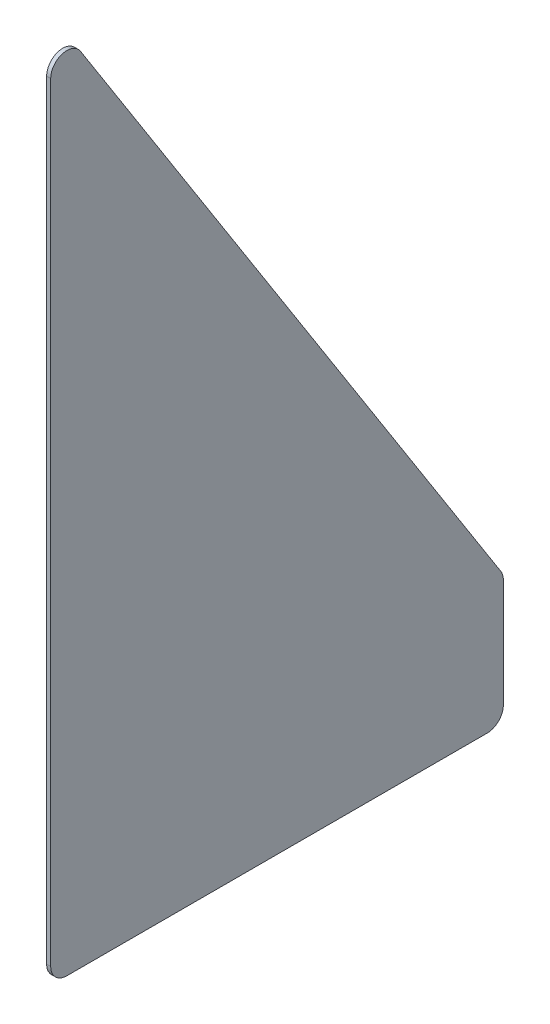
ISO-10303-21;
HEADER;
FILE_DESCRIPTION(('STEP AP214'),'2;1');
FILE_NAME('part.step','',(''),(''),'','','');
FILE_SCHEMA(('AUTOMOTIVE_DESIGN { 1 0 10303 214 1 1 1 1 }'));
ENDSEC;
DATA;
#1=APPLICATION_CONTEXT('core data for automotive mechanical design processes');
#2=APPLICATION_PROTOCOL_DEFINITION('international standard','automotive_design',2000,#1);
#3=PRODUCT_CONTEXT('',#1,'mechanical');
#4=PRODUCT('Part','Part','',(#3));
#5=PRODUCT_RELATED_PRODUCT_CATEGORY('part','',(#4));
#6=PRODUCT_DEFINITION_FORMATION('','',#4);
#7=PRODUCT_DEFINITION_CONTEXT('part definition',#1,'design');
#8=PRODUCT_DEFINITION('design','',#6,#7);
#9=PRODUCT_DEFINITION_SHAPE('','',#8);
#10=(LENGTH_UNIT() NAMED_UNIT(*) SI_UNIT(.MILLI.,.METRE.));
#11=(NAMED_UNIT(*) PLANE_ANGLE_UNIT() SI_UNIT($,.RADIAN.));
#12=(NAMED_UNIT(*) SI_UNIT($,.STERADIAN.) SOLID_ANGLE_UNIT());
#13=UNCERTAINTY_MEASURE_WITH_UNIT(LENGTH_MEASURE(1.E-05),#10,'distance_accuracy_value','');
#14=(GEOMETRIC_REPRESENTATION_CONTEXT(3) GLOBAL_UNCERTAINTY_ASSIGNED_CONTEXT((#13)) GLOBAL_UNIT_ASSIGNED_CONTEXT((#10,
#11,#12)) REPRESENTATION_CONTEXT('',''));
#15=CARTESIAN_POINT('',(0.,0.,0.));
#16=DIRECTION('',(0.,0.,1.));
#17=DIRECTION('',(1.,0.,0.));
#18=AXIS2_PLACEMENT_3D('',#15,#16,#17);
#19=CARTESIAN_POINT('',(1.58749999999941,330.2,0.));
#20=DIRECTION('',(0.,0.,-1.));
#21=DIRECTION('',(-1.,0.,0.));
#22=AXIS2_PLACEMENT_3D('',#19,#20,#21);
#23=PLANE('',#22);
#24=DIRECTION('',(0.,-1.,0.));
#25=VECTOR('',#24,1.);
#26=CARTESIAN_POINT('',(0.,330.2,0.));
#27=LINE('',#26,#25);
#28=CARTESIAN_POINT('',(0.,308.393732779132,0.));
#29=VERTEX_POINT('',#28);
#30=CARTESIAN_POINT('',(0.,6.35000000000002,0.));
#31=VERTEX_POINT('',#30);
#32=EDGE_CURVE('E124',#29,#31,#27,.T.);
#33=ORIENTED_EDGE('',*,*,#32,.T.);
#34=DIRECTION('',(1.,0.,0.));
#35=VECTOR('',#34,1.);
#36=CARTESIAN_POINT('',(1.58749999999941,6.35000000000002,0.));
#37=LINE('',#36,#35);
#38=CARTESIAN_POINT('',(1.58749999999941,6.35000000000002,0.));
#39=VERTEX_POINT('',#38);
#40=EDGE_CURVE('E150',#31,#39,#37,.T.);
#41=ORIENTED_EDGE('',*,*,#40,.T.);
#42=DIRECTION('',(0.,-1.,0.));
#43=VECTOR('',#42,1.);
#44=CARTESIAN_POINT('',(1.58749999999941,330.2,0.));
#45=LINE('',#44,#43);
#46=CARTESIAN_POINT('',(1.58749999999941,308.393732779132,0.));
#47=VERTEX_POINT('',#46);
#48=EDGE_CURVE('E128',#47,#39,#45,.T.);
#49=ORIENTED_EDGE('',*,*,#48,.F.);
#50=DIRECTION('',(1.,0.,0.));
#51=VECTOR('',#50,1.);
#52=CARTESIAN_POINT('',(1.58750000000013,308.393732779132,0.));
#53=LINE('',#52,#51);
#54=EDGE_CURVE('E148',#47,#29,#53,.F.);
#55=ORIENTED_EDGE('',*,*,#54,.T.);
#56=EDGE_LOOP('',(#33,#41,#49,#55));
#57=FACE_BOUND('',#56,.T.);
#58=ADVANCED_FACE('F36',(#57),#23,.F.);
#59=CARTESIAN_POINT('',(1.58749999999939,330.2,-177.8));
#60=DIRECTION('',(-1.,0.,0.));
#61=DIRECTION('',(0.,0.,1.));
#62=AXIS2_PLACEMENT_3D('',#59,#60,#61);
#63=PLANE('',#62);
#64=DIRECTION('',(0.,0.,-1.));
#65=VECTOR('',#64,1.);
#66=CARTESIAN_POINT('',(1.58749999999939,0.,-177.8));
#67=LINE('',#66,#65);
#68=CARTESIAN_POINT('',(1.58749999999941,0.,-6.34999999999997));
#69=VERTEX_POINT('',#68);
#70=CARTESIAN_POINT('',(1.58749999999939,0.,-171.45));
#71=VERTEX_POINT('',#70);
#72=EDGE_CURVE('E156',#69,#71,#67,.T.);
#73=ORIENTED_EDGE('',*,*,#72,.T.);
#74=CARTESIAN_POINT('',(1.58749999999939,6.35000000000002,-171.45));
#75=DIRECTION('',(-1.,0.,0.));
#76=DIRECTION('',(0.,0.,1.));
#77=AXIS2_PLACEMENT_3D('',#74,#75,#76);
#78=CIRCLE('',#77,6.35);
#79=CARTESIAN_POINT('',(1.58749999999939,6.35000000000002,-177.8));
#80=VERTEX_POINT('',#79);
#81=EDGE_CURVE('E146',#71,#80,#78,.F.);
#82=ORIENTED_EDGE('',*,*,#81,.T.);
#83=DIRECTION('',(0.,-1.,0.));
#84=VECTOR('',#83,1.);
#85=CARTESIAN_POINT('',(1.58749999999939,330.2,-177.8));
#86=LINE('',#85,#84);
#87=CARTESIAN_POINT('',(1.58749999999939,48.9508756362751,-177.8));
#88=VERTEX_POINT('',#87);
#89=EDGE_CURVE('E123',#88,#80,#86,.T.);
#90=ORIENTED_EDGE('',*,*,#89,.F.);
#91=CARTESIAN_POINT('',(1.58749999999941,48.9508756362751,-171.45));
#92=DIRECTION('',(-1.,0.,0.));
#93=DIRECTION('',(0.,0.,1.));
#94=AXIS2_PLACEMENT_3D('',#91,#92,#93);
#95=CIRCLE('',#94,6.35);
#96=CARTESIAN_POINT('',(1.58749999999941,52.3600350117017,-176.807250447099));
#97=VERTEX_POINT('',#96);
#98=EDGE_CURVE('E127',#88,#97,#95,.F.);
#99=ORIENTED_EDGE('',*,*,#98,.T.);
#100=DIRECTION('',(0.,-0.843661487732107,-0.536875492193159));
#101=VECTOR('',#100,1.);
#102=CARTESIAN_POINT('',(1.58749999999941,50.7999999999995,-177.8));
#103=LINE('',#102,#101);
#104=CARTESIAN_POINT('',(1.58749999999943,311.802892154559,-11.7072504470989));
#105=VERTEX_POINT('',#104);
#106=EDGE_CURVE('E155',#105,#97,#103,.T.);
#107=ORIENTED_EDGE('',*,*,#106,.F.);
#108=CARTESIAN_POINT('',(1.58749999999941,308.393732779132,-6.34999999999996));
#109=DIRECTION('',(-1.,0.,0.));
#110=DIRECTION('',(0.,0.,1.));
#111=AXIS2_PLACEMENT_3D('',#108,#109,#110);
#112=CIRCLE('',#111,6.35);
#113=EDGE_CURVE('E59',#105,#47,#112,.F.);
#114=ORIENTED_EDGE('',*,*,#113,.T.);
#115=ORIENTED_EDGE('',*,*,#48,.T.);
#116=CARTESIAN_POINT('',(1.58749999999941,6.35000000000002,-6.34999999999997));
#117=DIRECTION('',(-1.,0.,0.));
#118=DIRECTION('',(0.,0.,1.));
#119=AXIS2_PLACEMENT_3D('',#116,#117,#118);
#120=CIRCLE('',#119,6.35);
#121=EDGE_CURVE('E51',#39,#69,#120,.F.);
#122=ORIENTED_EDGE('',*,*,#121,.T.);
#123=EDGE_LOOP('',(#73,#82,#90,#99,#107,#114,#115,#122));
#124=FACE_BOUND('',#123,.T.);
#125=ADVANCED_FACE('F189',(#124),#63,.F.);
#126=CARTESIAN_POINT('',(-6.09683522952735E-13,330.2,-177.8));
#127=DIRECTION('',(0.,0.,1.));
#128=DIRECTION('',(1.,0.,0.));
#129=AXIS2_PLACEMENT_3D('',#126,#127,#128);
#130=PLANE('',#129);
#131=ORIENTED_EDGE('',*,*,#89,.T.);
#132=DIRECTION('',(-1.,0.,0.));
#133=VECTOR('',#132,1.);
#134=CARTESIAN_POINT('',(-6.09683522952735E-13,6.35000000000002,-177.8));
#135=LINE('',#134,#133);
#136=CARTESIAN_POINT('',(-6.09683522952735E-13,6.35000000000002,-177.8));
#137=VERTEX_POINT('',#136);
#138=EDGE_CURVE('E114',#80,#137,#135,.T.);
#139=ORIENTED_EDGE('',*,*,#138,.T.);
#140=DIRECTION('',(0.,-1.,0.));
#141=VECTOR('',#140,1.);
#142=CARTESIAN_POINT('',(-6.09683522952735E-13,330.2,-177.8));
#143=LINE('',#142,#141);
#144=CARTESIAN_POINT('',(-6.09683522952735E-13,48.9508756362751,-177.8));
#145=VERTEX_POINT('',#144);
#146=EDGE_CURVE('E106',#145,#137,#143,.T.);
#147=ORIENTED_EDGE('',*,*,#146,.F.);
#148=DIRECTION('',(-1.,0.,0.));
#149=VECTOR('',#148,1.);
#150=CARTESIAN_POINT('',(9.05825497346096E-13,48.9508756362751,-177.8));
#151=LINE('',#150,#149);
#152=EDGE_CURVE('E120',#145,#88,#151,.F.);
#153=ORIENTED_EDGE('',*,*,#152,.T.);
#154=EDGE_LOOP('',(#131,#139,#147,#153));
#155=FACE_BOUND('',#154,.T.);
#156=ADVANCED_FACE('F119',(#155),#130,.F.);
#157=CARTESIAN_POINT('',(0.,330.2,0.));
#158=DIRECTION('',(1.,0.,0.));
#159=DIRECTION('',(0.,0.,-1.));
#160=AXIS2_PLACEMENT_3D('',#157,#158,#159);
#161=PLANE('',#160);
#162=ORIENTED_EDGE('',*,*,#146,.T.);
#163=CARTESIAN_POINT('',(-5.87909111418709E-13,6.35000000000002,-171.45));
#164=DIRECTION('',(1.,0.,0.));
#165=DIRECTION('',(0.,0.,-1.));
#166=AXIS2_PLACEMENT_3D('',#163,#164,#165);
#167=CIRCLE('',#166,6.35);
#168=CARTESIAN_POINT('',(-5.87909111418709E-13,0.,-171.45));
#169=VERTEX_POINT('',#168);
#170=EDGE_CURVE('E137',#137,#169,#167,.F.);
#171=ORIENTED_EDGE('',*,*,#170,.T.);
#172=DIRECTION('',(0.,0.,1.));
#173=VECTOR('',#172,1.);
#174=CARTESIAN_POINT('',(0.,0.,0.));
#175=LINE('',#174,#173);
#176=CARTESIAN_POINT('',(0.,0.,-6.35));
#177=VERTEX_POINT('',#176);
#178=EDGE_CURVE('E159',#169,#177,#175,.T.);
#179=ORIENTED_EDGE('',*,*,#178,.T.);
#180=CARTESIAN_POINT('',(0.,6.35000000000002,-6.35));
#181=DIRECTION('',(1.,0.,0.));
#182=DIRECTION('',(0.,0.,-1.));
#183=AXIS2_PLACEMENT_3D('',#180,#181,#182);
#184=CIRCLE('',#183,6.35);
#185=EDGE_CURVE('E135',#177,#31,#184,.F.);
#186=ORIENTED_EDGE('',*,*,#185,.T.);
#187=ORIENTED_EDGE('',*,*,#32,.F.);
#188=CARTESIAN_POINT('',(0.,308.393732779132,-6.34999999999998));
#189=DIRECTION('',(1.,0.,0.));
#190=DIRECTION('',(0.,0.,-1.));
#191=AXIS2_PLACEMENT_3D('',#188,#189,#190);
#192=CIRCLE('',#191,6.35);
#193=CARTESIAN_POINT('',(0.,311.802892154559,-11.7072504470989));
#194=VERTEX_POINT('',#193);
#195=EDGE_CURVE('E113',#29,#194,#192,.F.);
#196=ORIENTED_EDGE('',*,*,#195,.T.);
#197=DIRECTION('',(0.,0.843661487732108,0.536875492193159));
#198=VECTOR('',#197,1.);
#199=CARTESIAN_POINT('',(-6.09683522952735E-13,50.8,-177.8));
#200=LINE('',#199,#198);
#201=CARTESIAN_POINT('',(-6.06279343847997E-13,52.3600350117017,-176.807250447099));
#202=VERTEX_POINT('',#201);
#203=EDGE_CURVE('E108',#202,#194,#200,.T.);
#204=ORIENTED_EDGE('',*,*,#203,.F.);
#205=CARTESIAN_POINT('',(-6.10622663543836E-13,48.9508756362751,-171.45));
#206=DIRECTION('',(1.,0.,0.));
#207=DIRECTION('',(0.,0.,-1.));
#208=AXIS2_PLACEMENT_3D('',#205,#206,#207);
#209=CIRCLE('',#208,6.35);
#210=EDGE_CURVE('E103',#202,#145,#209,.F.);
#211=ORIENTED_EDGE('',*,*,#210,.T.);
#212=EDGE_LOOP('',(#162,#171,#179,#186,#187,#196,#204,#211));
#213=FACE_BOUND('',#212,.T.);
#214=ADVANCED_FACE('F105',(#213),#161,.F.);
#215=CARTESIAN_POINT('',(0.,0.,0.));
#216=DIRECTION('',(0.,-1.,0.));
#217=DIRECTION('',(0.,0.,-1.));
#218=AXIS2_PLACEMENT_3D('',#215,#216,#217);
#219=PLANE('',#218);
#220=ORIENTED_EDGE('',*,*,#178,.F.);
#221=DIRECTION('',(-1.,0.,0.));
#222=VECTOR('',#221,1.);
#223=CARTESIAN_POINT('',(1.58749999999939,0.,-171.45));
#224=LINE('',#223,#222);
#225=EDGE_CURVE('E141',#169,#71,#224,.F.);
#226=ORIENTED_EDGE('',*,*,#225,.T.);
#227=ORIENTED_EDGE('',*,*,#72,.F.);
#228=DIRECTION('',(1.,0.,0.));
#229=VECTOR('',#228,1.);
#230=CARTESIAN_POINT('',(1.11022302462516E-13,0.,-6.35));
#231=LINE('',#230,#229);
#232=EDGE_CURVE('E139',#69,#177,#231,.F.);
#233=ORIENTED_EDGE('',*,*,#232,.T.);
#234=EDGE_LOOP('',(#220,#226,#227,#233));
#235=FACE_BOUND('',#234,.T.);
#236=ADVANCED_FACE('F173',(#235),#219,.T.);
#237=CARTESIAN_POINT('',(332.762982184294,50.8,-177.800000000001));
#238=DIRECTION('',(0.,-0.536875492193159,0.843661487732107));
#239=DIRECTION('',(0.,-0.843661487732107,-0.536875492193159));
#240=AXIS2_PLACEMENT_3D('',#237,#238,#239);
#241=PLANE('',#240);
#242=ORIENTED_EDGE('',*,*,#203,.T.);
#243=DIRECTION('',(1.,0.,0.));
#244=VECTOR('',#243,1.);
#245=CARTESIAN_POINT('',(332.762982184282,311.80289215457,-11.7072504470931));
#246=LINE('',#245,#244);
#247=EDGE_CURVE('E11',#194,#105,#246,.T.);
#248=ORIENTED_EDGE('',*,*,#247,.T.);
#249=ORIENTED_EDGE('',*,*,#106,.T.);
#250=DIRECTION('',(-1.,0.,0.));
#251=VECTOR('',#250,1.);
#252=CARTESIAN_POINT('',(332.762982184294,52.3600350117035,-176.807250447099));
#253=LINE('',#252,#251);
#254=EDGE_CURVE('E44',#97,#202,#253,.T.);
#255=ORIENTED_EDGE('',*,*,#254,.T.);
#256=EDGE_LOOP('',(#242,#248,#249,#255));
#257=FACE_BOUND('',#256,.T.);
#258=ADVANCED_FACE('F153',(#257),#241,.F.);
#259=CARTESIAN_POINT('',(-6.09683522952735E-13,6.35000000000002,-171.45));
#260=DIRECTION('',(1.,0.,0.));
#261=DIRECTION('',(0.,0.,-1.));
#262=AXIS2_PLACEMENT_3D('',#259,#260,#261);
#263=CYLINDRICAL_SURFACE('',#262,6.35);
#264=ORIENTED_EDGE('',*,*,#81,.F.);
#265=ORIENTED_EDGE('',*,*,#225,.F.);
#266=ORIENTED_EDGE('',*,*,#170,.F.);
#267=ORIENTED_EDGE('',*,*,#138,.F.);
#268=EDGE_LOOP('',(#264,#265,#266,#267));
#269=FACE_BOUND('',#268,.T.);
#270=ADVANCED_FACE('F168',(#269),#263,.T.);
#271=CARTESIAN_POINT('',(1.58749999999952,6.35000000000002,-6.34999999999997));
#272=DIRECTION('',(-1.,0.,0.));
#273=DIRECTION('',(0.,0.,1.));
#274=AXIS2_PLACEMENT_3D('',#271,#272,#273);
#275=CYLINDRICAL_SURFACE('',#274,6.35);
#276=ORIENTED_EDGE('',*,*,#185,.F.);
#277=ORIENTED_EDGE('',*,*,#232,.F.);
#278=ORIENTED_EDGE('',*,*,#121,.F.);
#279=ORIENTED_EDGE('',*,*,#40,.F.);
#280=EDGE_LOOP('',(#276,#277,#278,#279));
#281=FACE_BOUND('',#280,.T.);
#282=ADVANCED_FACE('F175',(#281),#275,.T.);
#283=CARTESIAN_POINT('',(332.762982184282,308.393732779143,-6.34999999999417));
#284=DIRECTION('',(1.,0.,0.));
#285=DIRECTION('',(0.,1.,0.));
#286=AXIS2_PLACEMENT_3D('',#283,#284,#285);
#287=CYLINDRICAL_SURFACE('',#286,6.35);
#288=ORIENTED_EDGE('',*,*,#195,.F.);
#289=ORIENTED_EDGE('',*,*,#54,.F.);
#290=ORIENTED_EDGE('',*,*,#113,.F.);
#291=ORIENTED_EDGE('',*,*,#247,.F.);
#292=EDGE_LOOP('',(#288,#289,#290,#291));
#293=FACE_BOUND('',#292,.T.);
#294=ADVANCED_FACE('F181',(#293),#287,.T.);
#295=CARTESIAN_POINT('',(332.762982184294,48.9508756362769,-171.45));
#296=DIRECTION('',(-1.,0.,0.));
#297=DIRECTION('',(0.,-1.,0.));
#298=AXIS2_PLACEMENT_3D('',#295,#296,#297);
#299=CYLINDRICAL_SURFACE('',#298,6.35);
#300=ORIENTED_EDGE('',*,*,#98,.F.);
#301=ORIENTED_EDGE('',*,*,#152,.F.);
#302=ORIENTED_EDGE('',*,*,#210,.F.);
#303=ORIENTED_EDGE('',*,*,#254,.F.);
#304=EDGE_LOOP('',(#300,#301,#302,#303));
#305=FACE_BOUND('',#304,.T.);
#306=ADVANCED_FACE('F38',(#305),#299,.T.);
#307=CLOSED_SHELL('',(#58,#125,#156,#214,#236,#258,#270,#282,#294,#306));
#308=MANIFOLD_SOLID_BREP('B2',#307);
#309=ADVANCED_BREP_SHAPE_REPRESENTATION('',(#18,#308),#14);
#310=SHAPE_DEFINITION_REPRESENTATION(#9,#309);
ENDSEC;
END-ISO-10303-21;
